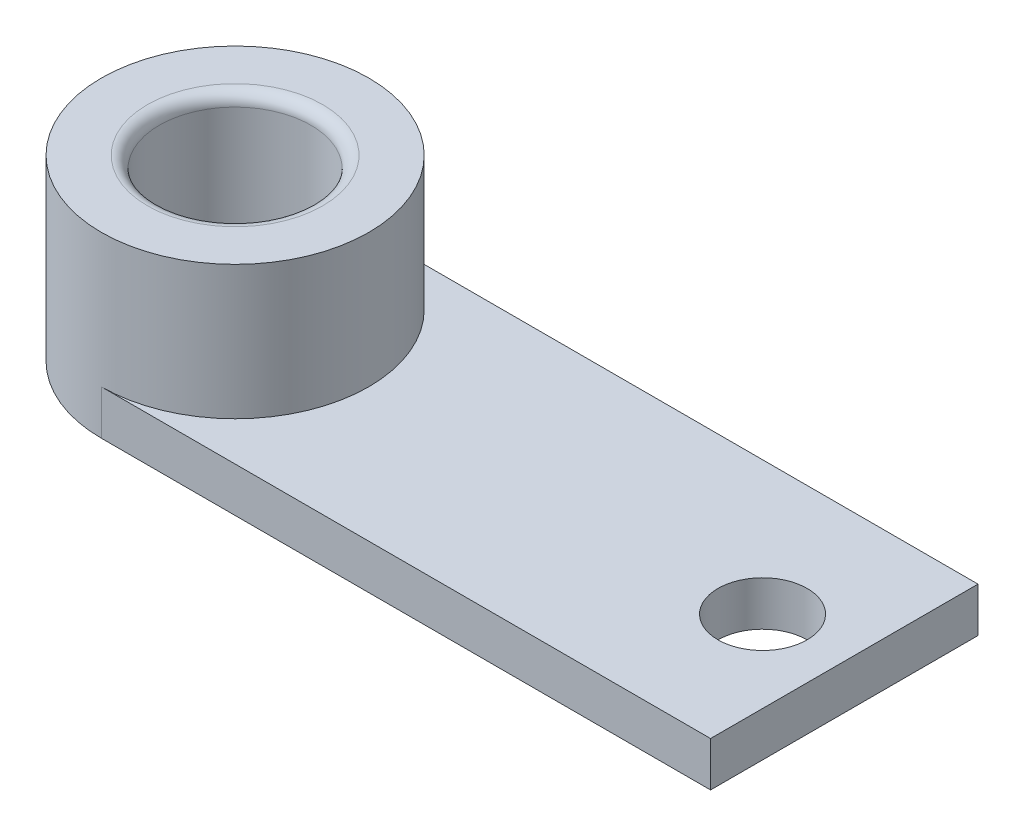
ISO-10303-21;
HEADER;
FILE_DESCRIPTION(('STEP AP214'),'2;1');
FILE_NAME('part.step','',(''),(''),'','','');
FILE_SCHEMA(('AUTOMOTIVE_DESIGN { 1 0 10303 214 1 1 1 1 }'));
ENDSEC;
DATA;
#1=APPLICATION_CONTEXT('core data for automotive mechanical design processes');
#2=APPLICATION_PROTOCOL_DEFINITION('international standard','automotive_design',2000,#1);
#3=PRODUCT_CONTEXT('',#1,'mechanical');
#4=PRODUCT('Part','Part','',(#3));
#5=PRODUCT_RELATED_PRODUCT_CATEGORY('part','',(#4));
#6=PRODUCT_DEFINITION_FORMATION('','',#4);
#7=PRODUCT_DEFINITION_CONTEXT('part definition',#1,'design');
#8=PRODUCT_DEFINITION('design','',#6,#7);
#9=PRODUCT_DEFINITION_SHAPE('','',#8);
#10=(LENGTH_UNIT() NAMED_UNIT(*) SI_UNIT(.MILLI.,.METRE.));
#11=(NAMED_UNIT(*) PLANE_ANGLE_UNIT() SI_UNIT($,.RADIAN.));
#12=(NAMED_UNIT(*) SI_UNIT($,.STERADIAN.) SOLID_ANGLE_UNIT());
#13=UNCERTAINTY_MEASURE_WITH_UNIT(LENGTH_MEASURE(1.E-05),#10,'distance_accuracy_value','');
#14=(GEOMETRIC_REPRESENTATION_CONTEXT(3) GLOBAL_UNCERTAINTY_ASSIGNED_CONTEXT((#13)) GLOBAL_UNIT_ASSIGNED_CONTEXT((#10,
#11,#12)) REPRESENTATION_CONTEXT('',''));
#15=CARTESIAN_POINT('',(0.,0.,0.));
#16=DIRECTION('',(0.,0.,1.));
#17=DIRECTION('',(1.,0.,0.));
#18=AXIS2_PLACEMENT_3D('',#15,#16,#17);
#19=CARTESIAN_POINT('',(0.,6.,0.));
#20=DIRECTION('',(0.,1.,0.));
#21=DIRECTION('',(0.,0.,1.));
#22=AXIS2_PLACEMENT_3D('',#19,#20,#21);
#23=PLANE('',#22);
#24=CARTESIAN_POINT('',(4.5,6.,-4.5));
#25=DIRECTION('',(0.,1.,0.));
#26=DIRECTION('',(0.,0.,1.));
#27=AXIS2_PLACEMENT_3D('',#24,#25,#26);
#28=CIRCLE('',#27,2.95);
#29=CARTESIAN_POINT('',(4.5,6.,-1.55));
#30=VERTEX_POINT('',#29);
#31=EDGE_CURVE('E11',#30,#30,#28,.F.);
#32=ORIENTED_EDGE('',*,*,#31,.T.);
#33=EDGE_LOOP('',(#32));
#34=FACE_BOUND('',#33,.T.);
#35=CARTESIAN_POINT('',(4.5,6.,-4.5));
#36=DIRECTION('',(0.,1.,0.));
#37=DIRECTION('',(0.,0.,1.));
#38=AXIS2_PLACEMENT_3D('',#35,#36,#37);
#39=CIRCLE('',#38,4.5);
#40=CARTESIAN_POINT('',(4.5,6.,0.));
#41=VERTEX_POINT('',#40);
#42=EDGE_CURVE('E248',#41,#41,#39,.T.);
#43=ORIENTED_EDGE('',*,*,#42,.T.);
#44=EDGE_LOOP('',(#43));
#45=FACE_BOUND('',#44,.T.);
#46=ADVANCED_FACE('F39',(#34,#45),#23,.T.);
#47=CARTESIAN_POINT('',(0.,0.,0.));
#48=DIRECTION('',(0.,1.,0.));
#49=DIRECTION('',(0.,0.,1.));
#50=AXIS2_PLACEMENT_3D('',#47,#48,#49);
#51=PLANE('',#50);
#52=CARTESIAN_POINT('',(4.5,0.,-4.5));
#53=DIRECTION('',(0.,-1.,0.));
#54=DIRECTION('',(0.,0.,-1.));
#55=AXIS2_PLACEMENT_3D('',#52,#53,#54);
#56=CIRCLE('',#55,1.);
#57=CARTESIAN_POINT('',(4.5,0.,-5.5));
#58=VERTEX_POINT('',#57);
#59=EDGE_CURVE('E276',#58,#58,#56,.T.);
#60=ORIENTED_EDGE('',*,*,#59,.F.);
#61=EDGE_LOOP('',(#60));
#62=FACE_BOUND('',#61,.T.);
#63=CARTESIAN_POINT('',(22.25,0.,-4.5));
#64=DIRECTION('',(0.,1.,0.));
#65=DIRECTION('',(0.,0.,1.));
#66=AXIS2_PLACEMENT_3D('',#63,#64,#65);
#67=CIRCLE('',#66,1.5);
#68=CARTESIAN_POINT('',(22.25,0.,-3.));
#69=VERTEX_POINT('',#68);
#70=EDGE_CURVE('E111',#69,#69,#67,.T.);
#71=ORIENTED_EDGE('',*,*,#70,.T.);
#72=EDGE_LOOP('',(#71));
#73=FACE_BOUND('',#72,.T.);
#74=DIRECTION('',(1.,0.,0.));
#75=VECTOR('',#74,1.);
#76=CARTESIAN_POINT('',(0.,0.,0.));
#77=LINE('',#76,#75);
#78=CARTESIAN_POINT('',(4.5,0.,0.));
#79=VERTEX_POINT('',#78);
#80=CARTESIAN_POINT('',(25.,0.,0.));
#81=VERTEX_POINT('',#80);
#82=EDGE_CURVE('E64',#79,#81,#77,.T.);
#83=ORIENTED_EDGE('',*,*,#82,.F.);
#84=CARTESIAN_POINT('',(4.5,0.,-4.5));
#85=DIRECTION('',(0.,1.,0.));
#86=DIRECTION('',(0.,0.,1.));
#87=AXIS2_PLACEMENT_3D('',#84,#85,#86);
#88=CIRCLE('',#87,4.5);
#89=CARTESIAN_POINT('',(4.5,0.,-9.));
#90=VERTEX_POINT('',#89);
#91=EDGE_CURVE('E85',#90,#79,#88,.T.);
#92=ORIENTED_EDGE('',*,*,#91,.F.);
#93=DIRECTION('',(-1.,0.,0.));
#94=VECTOR('',#93,1.);
#95=CARTESIAN_POINT('',(25.,0.,-9.));
#96=LINE('',#95,#94);
#97=CARTESIAN_POINT('',(25.,0.,-9.));
#98=VERTEX_POINT('',#97);
#99=EDGE_CURVE('E108',#98,#90,#96,.T.);
#100=ORIENTED_EDGE('',*,*,#99,.F.);
#101=DIRECTION('',(0.,0.,-1.));
#102=VECTOR('',#101,1.);
#103=CARTESIAN_POINT('',(25.,0.,0.));
#104=LINE('',#103,#102);
#105=EDGE_CURVE('E102',#81,#98,#104,.T.);
#106=ORIENTED_EDGE('',*,*,#105,.F.);
#107=EDGE_LOOP('',(#83,#92,#100,#106));
#108=FACE_BOUND('',#107,.T.);
#109=ADVANCED_FACE('F101',(#62,#73,#108),#51,.F.);
#110=CARTESIAN_POINT('',(0.,6.,0.));
#111=DIRECTION('',(0.,0.,-1.));
#112=DIRECTION('',(-1.,0.,0.));
#113=AXIS2_PLACEMENT_3D('',#110,#111,#112);
#114=PLANE('',#113);
#115=DIRECTION('',(0.,1.,0.));
#116=VECTOR('',#115,1.);
#117=CARTESIAN_POINT('',(4.5,0.,0.));
#118=LINE('',#117,#116);
#119=CARTESIAN_POINT('',(4.5,1.5,0.));
#120=VERTEX_POINT('',#119);
#121=EDGE_CURVE('E88',#79,#120,#118,.T.);
#122=ORIENTED_EDGE('',*,*,#121,.F.);
#123=ORIENTED_EDGE('',*,*,#82,.T.);
#124=DIRECTION('',(0.,-1.,0.));
#125=VECTOR('',#124,1.);
#126=CARTESIAN_POINT('',(25.,6.,0.));
#127=LINE('',#126,#125);
#128=CARTESIAN_POINT('',(25.,1.5,0.));
#129=VERTEX_POINT('',#128);
#130=EDGE_CURVE('E119',#129,#81,#127,.T.);
#131=ORIENTED_EDGE('',*,*,#130,.F.);
#132=DIRECTION('',(1.,0.,0.));
#133=VECTOR('',#132,1.);
#134=CARTESIAN_POINT('',(0.,1.5,0.));
#135=LINE('',#134,#133);
#136=EDGE_CURVE('E97',#120,#129,#135,.T.);
#137=ORIENTED_EDGE('',*,*,#136,.F.);
#138=EDGE_LOOP('',(#122,#123,#131,#137));
#139=FACE_BOUND('',#138,.T.);
#140=ADVANCED_FACE('F96',(#139),#114,.F.);
#141=CARTESIAN_POINT('',(25.,6.,0.));
#142=DIRECTION('',(-1.,0.,0.));
#143=DIRECTION('',(0.,0.,1.));
#144=AXIS2_PLACEMENT_3D('',#141,#142,#143);
#145=PLANE('',#144);
#146=DIRECTION('',(0.,0.,-1.));
#147=VECTOR('',#146,1.);
#148=CARTESIAN_POINT('',(25.,1.5,0.));
#149=LINE('',#148,#147);
#150=CARTESIAN_POINT('',(25.,1.5,-9.));
#151=VERTEX_POINT('',#150);
#152=EDGE_CURVE('E270',#129,#151,#149,.T.);
#153=ORIENTED_EDGE('',*,*,#152,.F.);
#154=ORIENTED_EDGE('',*,*,#130,.T.);
#155=ORIENTED_EDGE('',*,*,#105,.T.);
#156=DIRECTION('',(0.,-1.,0.));
#157=VECTOR('',#156,1.);
#158=CARTESIAN_POINT('',(25.,6.,-9.));
#159=LINE('',#158,#157);
#160=EDGE_CURVE('E56',#151,#98,#159,.T.);
#161=ORIENTED_EDGE('',*,*,#160,.F.);
#162=EDGE_LOOP('',(#153,#154,#155,#161));
#163=FACE_BOUND('',#162,.T.);
#164=ADVANCED_FACE('F158',(#163),#145,.F.);
#165=CARTESIAN_POINT('',(25.,6.,-9.));
#166=DIRECTION('',(0.,0.,1.));
#167=DIRECTION('',(1.,0.,0.));
#168=AXIS2_PLACEMENT_3D('',#165,#166,#167);
#169=PLANE('',#168);
#170=ORIENTED_EDGE('',*,*,#99,.T.);
#171=DIRECTION('',(0.,1.,0.));
#172=VECTOR('',#171,1.);
#173=CARTESIAN_POINT('',(4.5,0.,-9.));
#174=LINE('',#173,#172);
#175=CARTESIAN_POINT('',(4.5,1.5,-9.));
#176=VERTEX_POINT('',#175);
#177=EDGE_CURVE('E90',#90,#176,#174,.T.);
#178=ORIENTED_EDGE('',*,*,#177,.T.);
#179=DIRECTION('',(-1.,0.,0.));
#180=VECTOR('',#179,1.);
#181=CARTESIAN_POINT('',(0.,1.5,-9.));
#182=LINE('',#181,#180);
#183=EDGE_CURVE('E265',#151,#176,#182,.T.);
#184=ORIENTED_EDGE('',*,*,#183,.F.);
#185=ORIENTED_EDGE('',*,*,#160,.T.);
#186=EDGE_LOOP('',(#170,#178,#184,#185));
#187=FACE_BOUND('',#186,.T.);
#188=ADVANCED_FACE('F154',(#187),#169,.F.);
#189=CARTESIAN_POINT('',(22.25,0.,-4.5));
#190=DIRECTION('',(0.,1.,0.));
#191=DIRECTION('',(0.,0.,1.));
#192=AXIS2_PLACEMENT_3D('',#189,#190,#191);
#193=CYLINDRICAL_SURFACE('',#192,1.5);
#194=ORIENTED_EDGE('',*,*,#70,.F.);
#195=EDGE_LOOP('',(#194));
#196=FACE_BOUND('',#195,.T.);
#197=CARTESIAN_POINT('',(22.25,1.5,-4.5));
#198=DIRECTION('',(0.,1.,0.));
#199=DIRECTION('',(0.,0.,1.));
#200=AXIS2_PLACEMENT_3D('',#197,#198,#199);
#201=CIRCLE('',#200,1.5);
#202=CARTESIAN_POINT('',(22.25,1.5,-3.));
#203=VERTEX_POINT('',#202);
#204=EDGE_CURVE('E257',#203,#203,#201,.F.);
#205=ORIENTED_EDGE('',*,*,#204,.F.);
#206=EDGE_LOOP('',(#205));
#207=FACE_BOUND('',#206,.T.);
#208=ADVANCED_FACE('F157',(#196,#207),#193,.F.);
#209=CARTESIAN_POINT('',(4.5,1.,-4.5));
#210=DIRECTION('',(0.,1.,0.));
#211=DIRECTION('',(0.,0.,1.));
#212=AXIS2_PLACEMENT_3D('',#209,#210,#211);
#213=CYLINDRICAL_SURFACE('',#212,2.55);
#214=CARTESIAN_POINT('',(4.5,5.6,-4.5));
#215=DIRECTION('',(0.,1.,0.));
#216=DIRECTION('',(0.,0.,1.));
#217=AXIS2_PLACEMENT_3D('',#214,#215,#216);
#218=CIRCLE('',#217,2.55);
#219=CARTESIAN_POINT('',(4.5,5.6,-1.95));
#220=VERTEX_POINT('',#219);
#221=EDGE_CURVE('E49',#220,#220,#218,.T.);
#222=ORIENTED_EDGE('',*,*,#221,.T.);
#223=EDGE_LOOP('',(#222));
#224=FACE_BOUND('',#223,.T.);
#225=CARTESIAN_POINT('',(4.5,1.,-4.5));
#226=DIRECTION('',(0.,1.,0.));
#227=DIRECTION('',(0.,0.,1.));
#228=AXIS2_PLACEMENT_3D('',#225,#226,#227);
#229=CIRCLE('',#228,2.55);
#230=CARTESIAN_POINT('',(4.5,1.,-1.95));
#231=VERTEX_POINT('',#230);
#232=EDGE_CURVE('E104',#231,#231,#229,.T.);
#233=ORIENTED_EDGE('',*,*,#232,.F.);
#234=EDGE_LOOP('',(#233));
#235=FACE_BOUND('',#234,.T.);
#236=ADVANCED_FACE('F126',(#224,#235),#213,.F.);
#237=CARTESIAN_POINT('',(4.5,1.,-4.5));
#238=DIRECTION('',(0.,1.,0.));
#239=DIRECTION('',(0.,0.,1.));
#240=AXIS2_PLACEMENT_3D('',#237,#238,#239);
#241=PLANE('',#240);
#242=CARTESIAN_POINT('',(4.5,1.,-4.5));
#243=DIRECTION('',(0.,1.,0.));
#244=DIRECTION('',(0.,0.,1.));
#245=AXIS2_PLACEMENT_3D('',#242,#243,#244);
#246=CIRCLE('',#245,1.);
#247=CARTESIAN_POINT('',(4.5,1.,-3.5));
#248=VERTEX_POINT('',#247);
#249=EDGE_CURVE('E43',#248,#248,#246,.T.);
#250=ORIENTED_EDGE('',*,*,#249,.F.);
#251=EDGE_LOOP('',(#250));
#252=FACE_BOUND('',#251,.T.);
#253=ORIENTED_EDGE('',*,*,#232,.T.);
#254=EDGE_LOOP('',(#253));
#255=FACE_BOUND('',#254,.T.);
#256=ADVANCED_FACE('F188',(#252,#255),#241,.T.);
#257=CARTESIAN_POINT('',(4.5,1.5,-4.5));
#258=DIRECTION('',(0.,1.,0.));
#259=DIRECTION('',(0.,0.,1.));
#260=AXIS2_PLACEMENT_3D('',#257,#258,#259);
#261=CYLINDRICAL_SURFACE('',#260,4.5);
#262=ORIENTED_EDGE('',*,*,#42,.F.);
#263=EDGE_LOOP('',(#262));
#264=FACE_BOUND('',#263,.T.);
#265=ORIENTED_EDGE('',*,*,#121,.T.);
#266=CARTESIAN_POINT('',(4.5,1.5,-4.5));
#267=DIRECTION('',(0.,1.,0.));
#268=DIRECTION('',(0.,0.,1.));
#269=AXIS2_PLACEMENT_3D('',#266,#267,#268);
#270=CIRCLE('',#269,4.5);
#271=EDGE_CURVE('E250',#120,#176,#270,.T.);
#272=ORIENTED_EDGE('',*,*,#271,.T.);
#273=ORIENTED_EDGE('',*,*,#177,.F.);
#274=ORIENTED_EDGE('',*,*,#91,.T.);
#275=EDGE_LOOP('',(#265,#272,#273,#274));
#276=FACE_BOUND('',#275,.T.);
#277=ADVANCED_FACE('F86',(#264,#276),#261,.T.);
#278=CARTESIAN_POINT('',(0.,1.5,0.));
#279=DIRECTION('',(0.,1.,0.));
#280=DIRECTION('',(0.,0.,1.));
#281=AXIS2_PLACEMENT_3D('',#278,#279,#280);
#282=PLANE('',#281);
#283=ORIENTED_EDGE('',*,*,#271,.F.);
#284=ORIENTED_EDGE('',*,*,#136,.T.);
#285=ORIENTED_EDGE('',*,*,#152,.T.);
#286=ORIENTED_EDGE('',*,*,#183,.T.);
#287=EDGE_LOOP('',(#283,#284,#285,#286));
#288=FACE_BOUND('',#287,.T.);
#289=ORIENTED_EDGE('',*,*,#204,.T.);
#290=EDGE_LOOP('',(#289));
#291=FACE_BOUND('',#290,.T.);
#292=ADVANCED_FACE('F131',(#288,#291),#282,.T.);
#293=CARTESIAN_POINT('',(4.5,5.6,-4.5));
#294=DIRECTION('',(0.,1.,0.));
#295=DIRECTION('',(0.,0.,1.));
#296=AXIS2_PLACEMENT_3D('',#293,#294,#295);
#297=TOROIDAL_SURFACE('',#296,2.95,0.4);
#298=ORIENTED_EDGE('',*,*,#31,.F.);
#299=EDGE_LOOP('',(#298));
#300=FACE_BOUND('',#299,.T.);
#301=ORIENTED_EDGE('',*,*,#221,.F.);
#302=EDGE_LOOP('',(#301));
#303=FACE_BOUND('',#302,.T.);
#304=ADVANCED_FACE('F41',(#300,#303),#297,.T.);
#305=CARTESIAN_POINT('',(4.5,6.,-4.5));
#306=DIRECTION('',(0.,-1.,0.));
#307=DIRECTION('',(0.,0.,-1.));
#308=AXIS2_PLACEMENT_3D('',#305,#306,#307);
#309=CYLINDRICAL_SURFACE('',#308,1.);
#310=ORIENTED_EDGE('',*,*,#249,.T.);
#311=EDGE_LOOP('',(#310));
#312=FACE_BOUND('',#311,.T.);
#313=ORIENTED_EDGE('',*,*,#59,.T.);
#314=EDGE_LOOP('',(#313));
#315=FACE_BOUND('',#314,.T.);
#316=ADVANCED_FACE('F130',(#312,#315),#309,.F.);
#317=CLOSED_SHELL('',(#46,#109,#140,#164,#188,#208,#236,#256,#277,#292,#304,#316));
#318=MANIFOLD_SOLID_BREP('B2',#317);
#319=ADVANCED_BREP_SHAPE_REPRESENTATION('',(#18,#318),#14);
#320=SHAPE_DEFINITION_REPRESENTATION(#9,#319);
ENDSEC;
END-ISO-10303-21;
